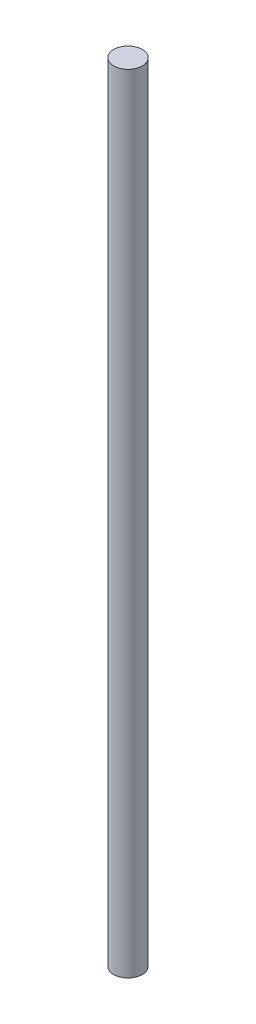
ISO-10303-21;
HEADER;
FILE_DESCRIPTION(('STEP AP214'),'2;1');
FILE_NAME('part.step','',(''),(''),'','','');
FILE_SCHEMA(('AUTOMOTIVE_DESIGN { 1 0 10303 214 1 1 1 1 }'));
ENDSEC;
DATA;
#1=APPLICATION_CONTEXT('core data for automotive mechanical design processes');
#2=APPLICATION_PROTOCOL_DEFINITION('international standard','automotive_design',2000,#1);
#3=PRODUCT_CONTEXT('',#1,'mechanical');
#4=PRODUCT('Part','Part','',(#3));
#5=PRODUCT_RELATED_PRODUCT_CATEGORY('part','',(#4));
#6=PRODUCT_DEFINITION_FORMATION('','',#4);
#7=PRODUCT_DEFINITION_CONTEXT('part definition',#1,'design');
#8=PRODUCT_DEFINITION('design','',#6,#7);
#9=PRODUCT_DEFINITION_SHAPE('','',#8);
#10=(LENGTH_UNIT() NAMED_UNIT(*) SI_UNIT(.MILLI.,.METRE.));
#11=(NAMED_UNIT(*) PLANE_ANGLE_UNIT() SI_UNIT($,.RADIAN.));
#12=(NAMED_UNIT(*) SI_UNIT($,.STERADIAN.) SOLID_ANGLE_UNIT());
#13=UNCERTAINTY_MEASURE_WITH_UNIT(LENGTH_MEASURE(1.E-05),#10,'distance_accuracy_value','');
#14=(GEOMETRIC_REPRESENTATION_CONTEXT(3) GLOBAL_UNCERTAINTY_ASSIGNED_CONTEXT((#13)) GLOBAL_UNIT_ASSIGNED_CONTEXT((#10,
#11,#12)) REPRESENTATION_CONTEXT('',''));
#15=CARTESIAN_POINT('',(0.,0.,0.));
#16=DIRECTION('',(0.,0.,1.));
#17=DIRECTION('',(1.,0.,0.));
#18=AXIS2_PLACEMENT_3D('',#15,#16,#17);
#19=CARTESIAN_POINT('',(-5.32682283546771,165.,0.));
#20=DIRECTION('',(0.,-1.,0.));
#21=DIRECTION('',(0.,0.,-1.));
#22=AXIS2_PLACEMENT_3D('',#19,#20,#21);
#23=CYLINDRICAL_SURFACE('',#22,3.);
#24=CARTESIAN_POINT('',(-5.32682283546771,165.,0.));
#25=DIRECTION('',(0.,1.,0.));
#26=DIRECTION('',(0.,0.,1.));
#27=AXIS2_PLACEMENT_3D('',#24,#25,#26);
#28=CIRCLE('',#27,3.);
#29=CARTESIAN_POINT('',(-5.32682283546771,165.,3.));
#30=VERTEX_POINT('',#29);
#31=EDGE_CURVE('E10',#30,#30,#28,.T.);
#32=ORIENTED_EDGE('',*,*,#31,.F.);
#33=EDGE_LOOP('',(#32));
#34=FACE_BOUND('',#33,.T.);
#35=CARTESIAN_POINT('',(-5.32682283546771,0.,0.));
#36=DIRECTION('',(0.,1.,0.));
#37=DIRECTION('',(0.,0.,1.));
#38=AXIS2_PLACEMENT_3D('',#35,#36,#37);
#39=CIRCLE('',#38,3.);
#40=CARTESIAN_POINT('',(-5.32682283546771,0.,3.));
#41=VERTEX_POINT('',#40);
#42=EDGE_CURVE('E36',#41,#41,#39,.T.);
#43=ORIENTED_EDGE('',*,*,#42,.T.);
#44=EDGE_LOOP('',(#43));
#45=FACE_BOUND('',#44,.T.);
#46=ADVANCED_FACE('F33',(#34,#45),#23,.T.);
#47=CARTESIAN_POINT('',(-5.32682283546771,165.,0.));
#48=DIRECTION('',(0.,1.,0.));
#49=DIRECTION('',(0.,0.,1.));
#50=AXIS2_PLACEMENT_3D('',#47,#48,#49);
#51=PLANE('',#50);
#52=ORIENTED_EDGE('',*,*,#31,.T.);
#53=EDGE_LOOP('',(#52));
#54=FACE_BOUND('',#53,.T.);
#55=ADVANCED_FACE('F48',(#54),#51,.T.);
#56=CARTESIAN_POINT('',(-5.32682283546771,0.,0.));
#57=DIRECTION('',(0.,1.,0.));
#58=DIRECTION('',(0.,0.,1.));
#59=AXIS2_PLACEMENT_3D('',#56,#57,#58);
#60=PLANE('',#59);
#61=ORIENTED_EDGE('',*,*,#42,.F.);
#62=EDGE_LOOP('',(#61));
#63=FACE_BOUND('',#62,.T.);
#64=ADVANCED_FACE('F46',(#63),#60,.F.);
#65=CLOSED_SHELL('',(#46,#55,#64));
#66=MANIFOLD_SOLID_BREP('B2',#65);
#67=ADVANCED_BREP_SHAPE_REPRESENTATION('',(#18,#66),#14);
#68=SHAPE_DEFINITION_REPRESENTATION(#9,#67);
ENDSEC;
END-ISO-10303-21;
